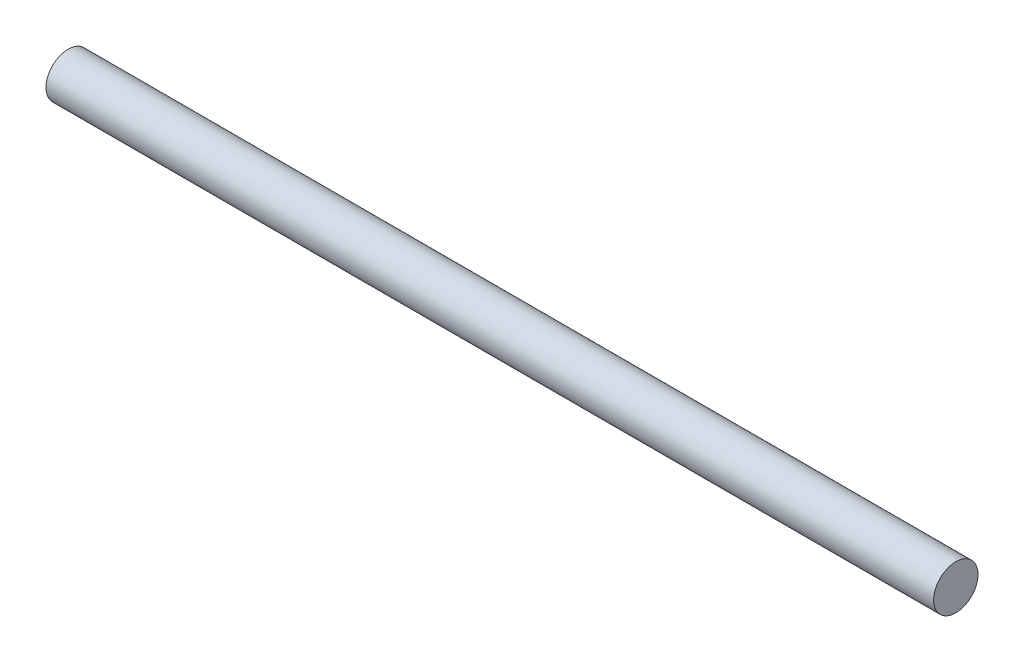
ISO-10303-21;
HEADER;
FILE_DESCRIPTION(('STEP AP214'),'2;1');
FILE_NAME('part.step','',(''),(''),'','','');
FILE_SCHEMA(('AUTOMOTIVE_DESIGN { 1 0 10303 214 1 1 1 1 }'));
ENDSEC;
DATA;
#1=APPLICATION_CONTEXT('core data for automotive mechanical design processes');
#2=APPLICATION_PROTOCOL_DEFINITION('international standard','automotive_design',2000,#1);
#3=PRODUCT_CONTEXT('',#1,'mechanical');
#4=PRODUCT('Part','Part','',(#3));
#5=PRODUCT_RELATED_PRODUCT_CATEGORY('part','',(#4));
#6=PRODUCT_DEFINITION_FORMATION('','',#4);
#7=PRODUCT_DEFINITION_CONTEXT('part definition',#1,'design');
#8=PRODUCT_DEFINITION('design','',#6,#7);
#9=PRODUCT_DEFINITION_SHAPE('','',#8);
#10=(LENGTH_UNIT() NAMED_UNIT(*) SI_UNIT(.MILLI.,.METRE.));
#11=(NAMED_UNIT(*) PLANE_ANGLE_UNIT() SI_UNIT($,.RADIAN.));
#12=(NAMED_UNIT(*) SI_UNIT($,.STERADIAN.) SOLID_ANGLE_UNIT());
#13=UNCERTAINTY_MEASURE_WITH_UNIT(LENGTH_MEASURE(1.E-05),#10,'distance_accuracy_value','');
#14=(GEOMETRIC_REPRESENTATION_CONTEXT(3) GLOBAL_UNCERTAINTY_ASSIGNED_CONTEXT((#13)) GLOBAL_UNIT_ASSIGNED_CONTEXT((#10,
#11,#12)) REPRESENTATION_CONTEXT('',''));
#15=CARTESIAN_POINT('',(0.,0.,0.));
#16=DIRECTION('',(0.,0.,1.));
#17=DIRECTION('',(1.,0.,0.));
#18=AXIS2_PLACEMENT_3D('',#15,#16,#17);
#19=CARTESIAN_POINT('',(101.6,0.,0.));
#20=DIRECTION('',(-1.,0.,0.));
#21=DIRECTION('',(0.,0.,1.));
#22=AXIS2_PLACEMENT_3D('',#19,#20,#21);
#23=CYLINDRICAL_SURFACE('',#22,2.54);
#24=CARTESIAN_POINT('',(101.6,0.,0.));
#25=DIRECTION('',(1.,0.,0.));
#26=DIRECTION('',(0.,0.,-1.));
#27=AXIS2_PLACEMENT_3D('',#24,#25,#26);
#28=CIRCLE('',#27,2.54);
#29=CARTESIAN_POINT('',(101.6,0.,-2.54));
#30=VERTEX_POINT('',#29);
#31=EDGE_CURVE('E10',#30,#30,#28,.T.);
#32=ORIENTED_EDGE('',*,*,#31,.F.);
#33=EDGE_LOOP('',(#32));
#34=FACE_BOUND('',#33,.T.);
#35=CARTESIAN_POINT('',(0.,0.,0.));
#36=DIRECTION('',(1.,0.,0.));
#37=DIRECTION('',(0.,0.,-1.));
#38=AXIS2_PLACEMENT_3D('',#35,#36,#37);
#39=CIRCLE('',#38,2.54);
#40=CARTESIAN_POINT('',(0.,0.,-2.54));
#41=VERTEX_POINT('',#40);
#42=EDGE_CURVE('E40',#41,#41,#39,.T.);
#43=ORIENTED_EDGE('',*,*,#42,.T.);
#44=EDGE_LOOP('',(#43));
#45=FACE_BOUND('',#44,.T.);
#46=ADVANCED_FACE('F37',(#34,#45),#23,.T.);
#47=CARTESIAN_POINT('',(101.6,0.,0.));
#48=DIRECTION('',(1.,0.,0.));
#49=DIRECTION('',(0.,0.,-1.));
#50=AXIS2_PLACEMENT_3D('',#47,#48,#49);
#51=PLANE('',#50);
#52=ORIENTED_EDGE('',*,*,#31,.T.);
#53=EDGE_LOOP('',(#52));
#54=FACE_BOUND('',#53,.T.);
#55=ADVANCED_FACE('F54',(#54),#51,.T.);
#56=CARTESIAN_POINT('',(0.,0.,0.));
#57=DIRECTION('',(1.,0.,0.));
#58=DIRECTION('',(0.,0.,-1.));
#59=AXIS2_PLACEMENT_3D('',#56,#57,#58);
#60=PLANE('',#59);
#61=ORIENTED_EDGE('',*,*,#42,.F.);
#62=EDGE_LOOP('',(#61));
#63=FACE_BOUND('',#62,.T.);
#64=ADVANCED_FACE('F52',(#63),#60,.F.);
#65=CLOSED_SHELL('',(#46,#55,#64));
#66=MANIFOLD_SOLID_BREP('B2',#65);
#67=ADVANCED_BREP_SHAPE_REPRESENTATION('',(#18,#66),#14);
#68=SHAPE_DEFINITION_REPRESENTATION(#9,#67);
ENDSEC;
END-ISO-10303-21;
